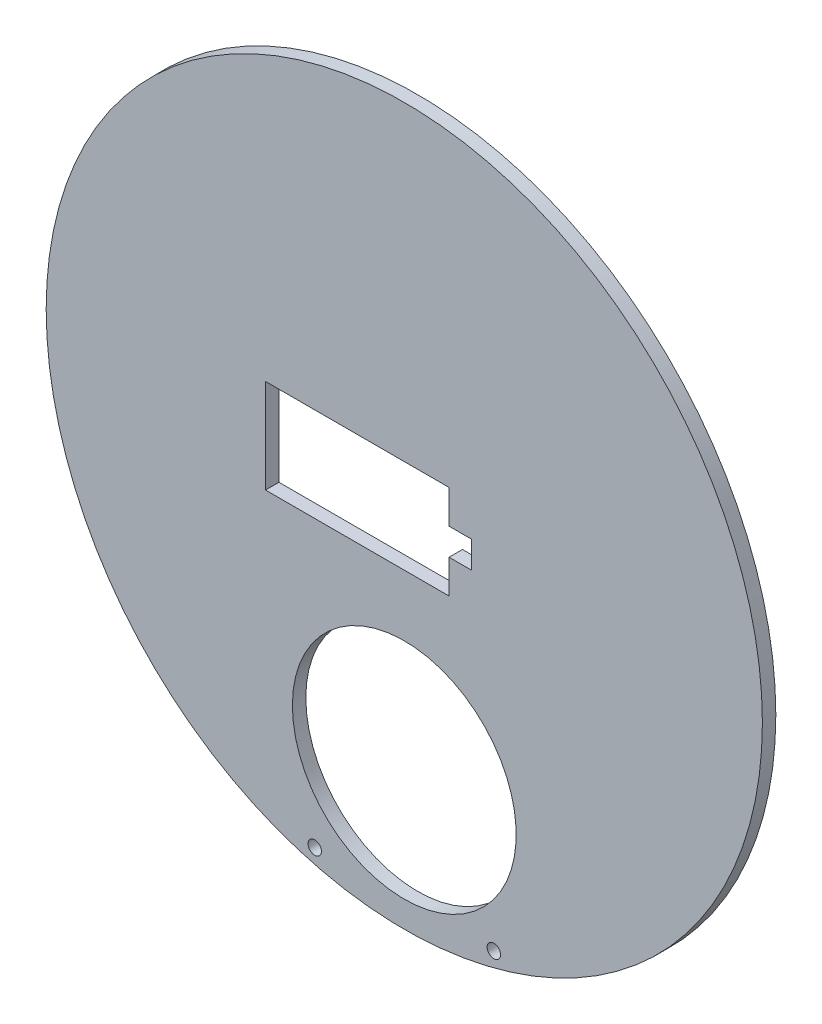
ISO-10303-21;
HEADER;
FILE_DESCRIPTION(('STEP AP214'),'2;1');
FILE_NAME('part.step','',(''),(''),'','','');
FILE_SCHEMA(('AUTOMOTIVE_DESIGN { 1 0 10303 214 1 1 1 1 }'));
ENDSEC;
DATA;
#1=APPLICATION_CONTEXT('core data for automotive mechanical design processes');
#2=APPLICATION_PROTOCOL_DEFINITION('international standard','automotive_design',2000,#1);
#3=PRODUCT_CONTEXT('',#1,'mechanical');
#4=PRODUCT('Part','Part','',(#3));
#5=PRODUCT_RELATED_PRODUCT_CATEGORY('part','',(#4));
#6=PRODUCT_DEFINITION_FORMATION('','',#4);
#7=PRODUCT_DEFINITION_CONTEXT('part definition',#1,'design');
#8=PRODUCT_DEFINITION('design','',#6,#7);
#9=PRODUCT_DEFINITION_SHAPE('','',#8);
#10=(LENGTH_UNIT() NAMED_UNIT(*) SI_UNIT(.MILLI.,.METRE.));
#11=(NAMED_UNIT(*) PLANE_ANGLE_UNIT() SI_UNIT($,.RADIAN.));
#12=(NAMED_UNIT(*) SI_UNIT($,.STERADIAN.) SOLID_ANGLE_UNIT());
#13=UNCERTAINTY_MEASURE_WITH_UNIT(LENGTH_MEASURE(1.E-05),#10,'distance_accuracy_value','');
#14=(GEOMETRIC_REPRESENTATION_CONTEXT(3) GLOBAL_UNCERTAINTY_ASSIGNED_CONTEXT((#13)) GLOBAL_UNIT_ASSIGNED_CONTEXT((#10,
#11,#12)) REPRESENTATION_CONTEXT('',''));
#15=CARTESIAN_POINT('',(0.,0.,0.));
#16=DIRECTION('',(0.,0.,1.));
#17=DIRECTION('',(1.,0.,0.));
#18=AXIS2_PLACEMENT_3D('',#15,#16,#17);
#19=CARTESIAN_POINT('',(-11.1979245368425,8.24446622018527,3.));
#20=DIRECTION('',(0.,0.,-1.));
#21=DIRECTION('',(-1.,0.,0.));
#22=AXIS2_PLACEMENT_3D('',#19,#20,#21);
#23=CYLINDRICAL_SURFACE('',#22,80.);
#24=CARTESIAN_POINT('',(-11.1979245368425,8.24446622018527,3.));
#25=DIRECTION('',(0.,0.,1.));
#26=DIRECTION('',(1.,0.,0.));
#27=AXIS2_PLACEMENT_3D('',#24,#25,#26);
#28=CIRCLE('',#27,80.);
#29=CARTESIAN_POINT('',(68.8020754631575,8.24446622018527,3.));
#30=VERTEX_POINT('',#29);
#31=EDGE_CURVE('E12',#30,#30,#28,.T.);
#32=ORIENTED_EDGE('',*,*,#31,.F.);
#33=EDGE_LOOP('',(#32));
#34=FACE_BOUND('',#33,.T.);
#35=CARTESIAN_POINT('',(-11.1979245368425,8.24446622018527,0.));
#36=DIRECTION('',(0.,0.,1.));
#37=DIRECTION('',(1.,0.,0.));
#38=AXIS2_PLACEMENT_3D('',#35,#36,#37);
#39=CIRCLE('',#38,80.);
#40=CARTESIAN_POINT('',(68.8020754631575,8.24446622018527,0.));
#41=VERTEX_POINT('',#40);
#42=EDGE_CURVE('E48',#41,#41,#39,.T.);
#43=ORIENTED_EDGE('',*,*,#42,.T.);
#44=EDGE_LOOP('',(#43));
#45=FACE_BOUND('',#44,.T.);
#46=ADVANCED_FACE('F45',(#34,#45),#23,.T.);
#47=CARTESIAN_POINT('',(-11.1979245368425,8.24446622018527,3.));
#48=DIRECTION('',(0.,0.,1.));
#49=DIRECTION('',(1.,0.,0.));
#50=AXIS2_PLACEMENT_3D('',#47,#48,#49);
#51=PLANE('',#50);
#52=CARTESIAN_POINT('',(-31.1979245368426,-65.9175186507713,3.));
#53=DIRECTION('',(0.,0.,-1.));
#54=DIRECTION('',(-1.,0.,0.));
#55=AXIS2_PLACEMENT_3D('',#52,#53,#54);
#56=CIRCLE('',#55,1.5);
#57=CARTESIAN_POINT('',(-32.6979245368426,-65.9175186507713,3.));
#58=VERTEX_POINT('',#57);
#59=EDGE_CURVE('E332',#58,#58,#56,.T.);
#60=ORIENTED_EDGE('',*,*,#59,.T.);
#61=EDGE_LOOP('',(#60));
#62=FACE_BOUND('',#61,.T.);
#63=CARTESIAN_POINT('',(8.80207546315744,-65.9198844889249,3.));
#64=DIRECTION('',(0.,0.,-1.));
#65=DIRECTION('',(-1.,0.,0.));
#66=AXIS2_PLACEMENT_3D('',#63,#64,#65);
#67=CIRCLE('',#66,1.5);
#68=CARTESIAN_POINT('',(7.30207546315744,-65.9198844889249,3.));
#69=VERTEX_POINT('',#68);
#70=EDGE_CURVE('E335',#69,#69,#67,.T.);
#71=ORIENTED_EDGE('',*,*,#70,.T.);
#72=EDGE_LOOP('',(#71));
#73=FACE_BOUND('',#72,.T.);
#74=CARTESIAN_POINT('',(-11.1979245368426,-40.9175186507713,3.));
#75=DIRECTION('',(0.,0.,-1.));
#76=DIRECTION('',(-1.,0.,0.));
#77=AXIS2_PLACEMENT_3D('',#74,#75,#76);
#78=CIRCLE('',#77,25.);
#79=CARTESIAN_POINT('',(-36.1979245368426,-40.9175186507713,3.));
#80=VERTEX_POINT('',#79);
#81=EDGE_CURVE('E149',#80,#80,#78,.T.);
#82=ORIENTED_EDGE('',*,*,#81,.T.);
#83=EDGE_LOOP('',(#82));
#84=FACE_BOUND('',#83,.T.);
#85=DIRECTION('',(0.,-1.,0.));
#86=VECTOR('',#85,1.);
#87=CARTESIAN_POINT('',(3.80207546315745,0.,3.));
#88=LINE('',#87,#86);
#89=CARTESIAN_POINT('',(3.80207546315745,11.2444662201853,3.));
#90=VERTEX_POINT('',#89);
#91=CARTESIAN_POINT('',(3.80207546315745,5.24446622018527,3.));
#92=VERTEX_POINT('',#91);
#93=EDGE_CURVE('E111',#90,#92,#88,.T.);
#94=ORIENTED_EDGE('',*,*,#93,.T.);
#95=DIRECTION('',(-1.,0.,0.));
#96=VECTOR('',#95,1.);
#97=CARTESIAN_POINT('',(0.,5.24446622018527,3.));
#98=LINE('',#97,#96);
#99=CARTESIAN_POINT('',(-1.19792453684255,5.24446622018527,3.));
#100=VERTEX_POINT('',#99);
#101=EDGE_CURVE('E120',#92,#100,#98,.T.);
#102=ORIENTED_EDGE('',*,*,#101,.T.);
#103=DIRECTION('',(0.,-1.,0.));
#104=VECTOR('',#103,1.);
#105=CARTESIAN_POINT('',(-1.19792453684255,0.,3.));
#106=LINE('',#105,#104);
#107=CARTESIAN_POINT('',(-1.19792453684255,-2.25553377981473,3.));
#108=VERTEX_POINT('',#107);
#109=EDGE_CURVE('E59',#100,#108,#106,.T.);
#110=ORIENTED_EDGE('',*,*,#109,.T.);
#111=DIRECTION('',(-1.,0.,0.));
#112=VECTOR('',#111,1.);
#113=CARTESIAN_POINT('',(0.,-2.25553377981473,3.));
#114=LINE('',#113,#112);
#115=CARTESIAN_POINT('',(-42.1979245368425,-2.25553377981473,3.));
#116=VERTEX_POINT('',#115);
#117=EDGE_CURVE('E137',#108,#116,#114,.T.);
#118=ORIENTED_EDGE('',*,*,#117,.T.);
#119=DIRECTION('',(0.,-1.,0.));
#120=VECTOR('',#119,1.);
#121=CARTESIAN_POINT('',(-42.1979245368425,0.,3.));
#122=LINE('',#121,#120);
#123=CARTESIAN_POINT('',(-42.1979245368425,18.7444662201853,3.));
#124=VERTEX_POINT('',#123);
#125=EDGE_CURVE('E140',#124,#116,#122,.T.);
#126=ORIENTED_EDGE('',*,*,#125,.F.);
#127=DIRECTION('',(-1.,0.,0.));
#128=VECTOR('',#127,1.);
#129=CARTESIAN_POINT('',(0.,18.7444662201853,3.));
#130=LINE('',#129,#128);
#131=CARTESIAN_POINT('',(-1.19792453684255,18.7444662201853,3.));
#132=VERTEX_POINT('',#131);
#133=EDGE_CURVE('E142',#132,#124,#130,.T.);
#134=ORIENTED_EDGE('',*,*,#133,.F.);
#135=DIRECTION('',(0.,-1.,0.));
#136=VECTOR('',#135,1.);
#137=CARTESIAN_POINT('',(-1.19792453684255,0.,3.));
#138=LINE('',#137,#136);
#139=CARTESIAN_POINT('',(-1.19792453684255,11.2444662201853,3.));
#140=VERTEX_POINT('',#139);
#141=EDGE_CURVE('E144',#132,#140,#138,.T.);
#142=ORIENTED_EDGE('',*,*,#141,.T.);
#143=DIRECTION('',(-1.,0.,0.));
#144=VECTOR('',#143,1.);
#145=CARTESIAN_POINT('',(0.,11.2444662201853,3.));
#146=LINE('',#145,#144);
#147=EDGE_CURVE('E117',#90,#140,#146,.T.);
#148=ORIENTED_EDGE('',*,*,#147,.F.);
#149=EDGE_LOOP('',(#94,#102,#110,#118,#126,#134,#142,#148));
#150=FACE_BOUND('',#149,.T.);
#151=ORIENTED_EDGE('',*,*,#31,.T.);
#152=EDGE_LOOP('',(#151));
#153=FACE_BOUND('',#152,.T.);
#154=ADVANCED_FACE('F124',(#62,#73,#84,#150,#153),#51,.T.);
#155=CARTESIAN_POINT('',(-11.1979245368425,8.24446622018527,0.));
#156=DIRECTION('',(0.,0.,1.));
#157=DIRECTION('',(1.,0.,0.));
#158=AXIS2_PLACEMENT_3D('',#155,#156,#157);
#159=PLANE('',#158);
#160=CARTESIAN_POINT('',(-31.1979245368426,-65.9175186507713,0.));
#161=DIRECTION('',(0.,0.,-1.));
#162=DIRECTION('',(-1.,0.,0.));
#163=AXIS2_PLACEMENT_3D('',#160,#161,#162);
#164=CIRCLE('',#163,1.5);
#165=CARTESIAN_POINT('',(-32.6979245368426,-65.9175186507713,0.));
#166=VERTEX_POINT('',#165);
#167=EDGE_CURVE('E334',#166,#166,#164,.T.);
#168=ORIENTED_EDGE('',*,*,#167,.F.);
#169=EDGE_LOOP('',(#168));
#170=FACE_BOUND('',#169,.T.);
#171=CARTESIAN_POINT('',(8.80207546315744,-65.9198844889249,0.));
#172=DIRECTION('',(0.,0.,-1.));
#173=DIRECTION('',(-1.,0.,0.));
#174=AXIS2_PLACEMENT_3D('',#171,#172,#173);
#175=CIRCLE('',#174,1.5);
#176=CARTESIAN_POINT('',(7.30207546315744,-65.9198844889249,0.));
#177=VERTEX_POINT('',#176);
#178=EDGE_CURVE('E338',#177,#177,#175,.T.);
#179=ORIENTED_EDGE('',*,*,#178,.F.);
#180=EDGE_LOOP('',(#179));
#181=FACE_BOUND('',#180,.T.);
#182=CARTESIAN_POINT('',(-11.1979245368426,-40.9175186507713,0.));
#183=DIRECTION('',(0.,0.,-1.));
#184=DIRECTION('',(-1.,0.,0.));
#185=AXIS2_PLACEMENT_3D('',#182,#183,#184);
#186=CIRCLE('',#185,25.);
#187=CARTESIAN_POINT('',(-36.1979245368426,-40.9175186507713,0.));
#188=VERTEX_POINT('',#187);
#189=EDGE_CURVE('E133',#188,#188,#186,.T.);
#190=ORIENTED_EDGE('',*,*,#189,.F.);
#191=EDGE_LOOP('',(#190));
#192=FACE_BOUND('',#191,.T.);
#193=DIRECTION('',(-1.,0.,0.));
#194=VECTOR('',#193,1.);
#195=CARTESIAN_POINT('',(0.,5.24446622018527,0.));
#196=LINE('',#195,#194);
#197=CARTESIAN_POINT('',(3.80207546315745,5.24446622018527,0.));
#198=VERTEX_POINT('',#197);
#199=CARTESIAN_POINT('',(-1.19792453684255,5.24446622018527,0.));
#200=VERTEX_POINT('',#199);
#201=EDGE_CURVE('E148',#198,#200,#196,.T.);
#202=ORIENTED_EDGE('',*,*,#201,.F.);
#203=DIRECTION('',(0.,-1.,0.));
#204=VECTOR('',#203,1.);
#205=CARTESIAN_POINT('',(3.80207546315745,0.,0.));
#206=LINE('',#205,#204);
#207=CARTESIAN_POINT('',(3.80207546315745,11.2444662201853,0.));
#208=VERTEX_POINT('',#207);
#209=EDGE_CURVE('E67',#208,#198,#206,.T.);
#210=ORIENTED_EDGE('',*,*,#209,.F.);
#211=DIRECTION('',(-1.,0.,0.));
#212=VECTOR('',#211,1.);
#213=CARTESIAN_POINT('',(0.,11.2444662201853,0.));
#214=LINE('',#213,#212);
#215=CARTESIAN_POINT('',(-1.19792453684255,11.2444662201853,0.));
#216=VERTEX_POINT('',#215);
#217=EDGE_CURVE('E127',#208,#216,#214,.T.);
#218=ORIENTED_EDGE('',*,*,#217,.T.);
#219=DIRECTION('',(0.,-1.,0.));
#220=VECTOR('',#219,1.);
#221=CARTESIAN_POINT('',(-1.19792453684255,0.,0.));
#222=LINE('',#221,#220);
#223=CARTESIAN_POINT('',(-1.19792453684255,18.7444662201853,0.));
#224=VERTEX_POINT('',#223);
#225=EDGE_CURVE('E130',#224,#216,#222,.T.);
#226=ORIENTED_EDGE('',*,*,#225,.F.);
#227=DIRECTION('',(-1.,0.,0.));
#228=VECTOR('',#227,1.);
#229=CARTESIAN_POINT('',(0.,18.7444662201853,0.));
#230=LINE('',#229,#228);
#231=CARTESIAN_POINT('',(-42.1979245368425,18.7444662201853,0.));
#232=VERTEX_POINT('',#231);
#233=EDGE_CURVE('E160',#224,#232,#230,.T.);
#234=ORIENTED_EDGE('',*,*,#233,.T.);
#235=DIRECTION('',(0.,-1.,0.));
#236=VECTOR('',#235,1.);
#237=CARTESIAN_POINT('',(-42.1979245368425,0.,0.));
#238=LINE('',#237,#236);
#239=CARTESIAN_POINT('',(-42.1979245368425,-2.25553377981473,0.));
#240=VERTEX_POINT('',#239);
#241=EDGE_CURVE('E157',#232,#240,#238,.T.);
#242=ORIENTED_EDGE('',*,*,#241,.T.);
#243=DIRECTION('',(-1.,0.,0.));
#244=VECTOR('',#243,1.);
#245=CARTESIAN_POINT('',(0.,-2.25553377981473,0.));
#246=LINE('',#245,#244);
#247=CARTESIAN_POINT('',(-1.19792453684255,-2.25553377981473,0.));
#248=VERTEX_POINT('',#247);
#249=EDGE_CURVE('E154',#248,#240,#246,.T.);
#250=ORIENTED_EDGE('',*,*,#249,.F.);
#251=DIRECTION('',(0.,-1.,0.));
#252=VECTOR('',#251,1.);
#253=CARTESIAN_POINT('',(-1.19792453684255,0.,0.));
#254=LINE('',#253,#252);
#255=EDGE_CURVE('E151',#200,#248,#254,.T.);
#256=ORIENTED_EDGE('',*,*,#255,.F.);
#257=EDGE_LOOP('',(#202,#210,#218,#226,#234,#242,#250,#256));
#258=FACE_BOUND('',#257,.T.);
#259=ORIENTED_EDGE('',*,*,#42,.F.);
#260=EDGE_LOOP('',(#259));
#261=FACE_BOUND('',#260,.T.);
#262=ADVANCED_FACE('F181',(#170,#181,#192,#258,#261),#159,.F.);
#263=CARTESIAN_POINT('',(3.80207546315745,0.,3.));
#264=DIRECTION('',(1.,0.,0.));
#265=DIRECTION('',(0.,1.,0.));
#266=AXIS2_PLACEMENT_3D('',#263,#264,#265);
#267=PLANE('',#266);
#268=ORIENTED_EDGE('',*,*,#209,.T.);
#269=DIRECTION('',(0.,0.,-1.));
#270=VECTOR('',#269,1.);
#271=CARTESIAN_POINT('',(3.80207546315745,5.24446622018527,3.));
#272=LINE('',#271,#270);
#273=EDGE_CURVE('E107',#92,#198,#272,.T.);
#274=ORIENTED_EDGE('',*,*,#273,.F.);
#275=ORIENTED_EDGE('',*,*,#93,.F.);
#276=DIRECTION('',(0.,0.,-1.));
#277=VECTOR('',#276,1.);
#278=CARTESIAN_POINT('',(3.80207546315745,11.2444662201853,3.));
#279=LINE('',#278,#277);
#280=EDGE_CURVE('E165',#90,#208,#279,.T.);
#281=ORIENTED_EDGE('',*,*,#280,.T.);
#282=EDGE_LOOP('',(#268,#274,#275,#281));
#283=FACE_BOUND('',#282,.T.);
#284=ADVANCED_FACE('F109',(#283),#267,.F.);
#285=CARTESIAN_POINT('',(0.,11.2444662201853,3.));
#286=DIRECTION('',(0.,-1.,0.));
#287=DIRECTION('',(0.,0.,-1.));
#288=AXIS2_PLACEMENT_3D('',#285,#286,#287);
#289=PLANE('',#288);
#290=ORIENTED_EDGE('',*,*,#217,.F.);
#291=ORIENTED_EDGE('',*,*,#280,.F.);
#292=ORIENTED_EDGE('',*,*,#147,.T.);
#293=DIRECTION('',(0.,0.,-1.));
#294=VECTOR('',#293,1.);
#295=CARTESIAN_POINT('',(-1.19792453684255,11.2444662201853,3.));
#296=LINE('',#295,#294);
#297=EDGE_CURVE('E167',#140,#216,#296,.T.);
#298=ORIENTED_EDGE('',*,*,#297,.T.);
#299=EDGE_LOOP('',(#290,#291,#292,#298));
#300=FACE_BOUND('',#299,.T.);
#301=ADVANCED_FACE('F203',(#300),#289,.T.);
#302=CARTESIAN_POINT('',(-1.19792453684255,0.,3.));
#303=DIRECTION('',(1.,0.,0.));
#304=DIRECTION('',(0.,1.,0.));
#305=AXIS2_PLACEMENT_3D('',#302,#303,#304);
#306=PLANE('',#305);
#307=ORIENTED_EDGE('',*,*,#225,.T.);
#308=ORIENTED_EDGE('',*,*,#297,.F.);
#309=ORIENTED_EDGE('',*,*,#141,.F.);
#310=DIRECTION('',(0.,0.,-1.));
#311=VECTOR('',#310,1.);
#312=CARTESIAN_POINT('',(-1.19792453684255,18.7444662201853,3.));
#313=LINE('',#312,#311);
#314=EDGE_CURVE('E169',#132,#224,#313,.T.);
#315=ORIENTED_EDGE('',*,*,#314,.T.);
#316=EDGE_LOOP('',(#307,#308,#309,#315));
#317=FACE_BOUND('',#316,.T.);
#318=ADVANCED_FACE('F200',(#317),#306,.F.);
#319=CARTESIAN_POINT('',(0.,18.7444662201853,3.));
#320=DIRECTION('',(0.,-1.,0.));
#321=DIRECTION('',(0.,0.,-1.));
#322=AXIS2_PLACEMENT_3D('',#319,#320,#321);
#323=PLANE('',#322);
#324=ORIENTED_EDGE('',*,*,#233,.F.);
#325=ORIENTED_EDGE('',*,*,#314,.F.);
#326=ORIENTED_EDGE('',*,*,#133,.T.);
#327=DIRECTION('',(0.,0.,-1.));
#328=VECTOR('',#327,1.);
#329=CARTESIAN_POINT('',(-42.1979245368425,18.7444662201853,3.));
#330=LINE('',#329,#328);
#331=EDGE_CURVE('E171',#124,#232,#330,.T.);
#332=ORIENTED_EDGE('',*,*,#331,.T.);
#333=EDGE_LOOP('',(#324,#325,#326,#332));
#334=FACE_BOUND('',#333,.T.);
#335=ADVANCED_FACE('F195',(#334),#323,.T.);
#336=CARTESIAN_POINT('',(-42.1979245368425,0.,3.));
#337=DIRECTION('',(1.,0.,0.));
#338=DIRECTION('',(0.,0.,-1.));
#339=AXIS2_PLACEMENT_3D('',#336,#337,#338);
#340=PLANE('',#339);
#341=ORIENTED_EDGE('',*,*,#241,.F.);
#342=ORIENTED_EDGE('',*,*,#331,.F.);
#343=ORIENTED_EDGE('',*,*,#125,.T.);
#344=DIRECTION('',(0.,0.,-1.));
#345=VECTOR('',#344,1.);
#346=CARTESIAN_POINT('',(-42.1979245368425,-2.25553377981473,3.));
#347=LINE('',#346,#345);
#348=EDGE_CURVE('E173',#116,#240,#347,.T.);
#349=ORIENTED_EDGE('',*,*,#348,.T.);
#350=EDGE_LOOP('',(#341,#342,#343,#349));
#351=FACE_BOUND('',#350,.T.);
#352=ADVANCED_FACE('F192',(#351),#340,.T.);
#353=CARTESIAN_POINT('',(0.,-2.25553377981473,3.));
#354=DIRECTION('',(0.,-1.,0.));
#355=DIRECTION('',(0.,0.,-1.));
#356=AXIS2_PLACEMENT_3D('',#353,#354,#355);
#357=PLANE('',#356);
#358=ORIENTED_EDGE('',*,*,#249,.T.);
#359=ORIENTED_EDGE('',*,*,#348,.F.);
#360=ORIENTED_EDGE('',*,*,#117,.F.);
#361=DIRECTION('',(0.,0.,-1.));
#362=VECTOR('',#361,1.);
#363=CARTESIAN_POINT('',(-1.19792453684255,-2.25553377981473,3.));
#364=LINE('',#363,#362);
#365=EDGE_CURVE('E175',#108,#248,#364,.T.);
#366=ORIENTED_EDGE('',*,*,#365,.T.);
#367=EDGE_LOOP('',(#358,#359,#360,#366));
#368=FACE_BOUND('',#367,.T.);
#369=ADVANCED_FACE('F186',(#368),#357,.F.);
#370=CARTESIAN_POINT('',(-1.19792453684255,0.,3.));
#371=DIRECTION('',(1.,0.,0.));
#372=DIRECTION('',(0.,1.,0.));
#373=AXIS2_PLACEMENT_3D('',#370,#371,#372);
#374=PLANE('',#373);
#375=ORIENTED_EDGE('',*,*,#255,.T.);
#376=ORIENTED_EDGE('',*,*,#365,.F.);
#377=ORIENTED_EDGE('',*,*,#109,.F.);
#378=DIRECTION('',(0.,0.,-1.));
#379=VECTOR('',#378,1.);
#380=CARTESIAN_POINT('',(-1.19792453684255,5.24446622018527,3.));
#381=LINE('',#380,#379);
#382=EDGE_CURVE('E116',#100,#200,#381,.T.);
#383=ORIENTED_EDGE('',*,*,#382,.T.);
#384=EDGE_LOOP('',(#375,#376,#377,#383));
#385=FACE_BOUND('',#384,.T.);
#386=ADVANCED_FACE('F177',(#385),#374,.F.);
#387=CARTESIAN_POINT('',(0.,5.24446622018527,3.));
#388=DIRECTION('',(0.,-1.,0.));
#389=DIRECTION('',(0.,0.,-1.));
#390=AXIS2_PLACEMENT_3D('',#387,#388,#389);
#391=PLANE('',#390);
#392=ORIENTED_EDGE('',*,*,#201,.T.);
#393=ORIENTED_EDGE('',*,*,#382,.F.);
#394=ORIENTED_EDGE('',*,*,#101,.F.);
#395=ORIENTED_EDGE('',*,*,#273,.T.);
#396=EDGE_LOOP('',(#392,#393,#394,#395));
#397=FACE_BOUND('',#396,.T.);
#398=ADVANCED_FACE('F121',(#397),#391,.F.);
#399=CARTESIAN_POINT('',(-11.1979245368426,-40.9175186507713,3.));
#400=DIRECTION('',(0.,0.,-1.));
#401=DIRECTION('',(-1.,0.,0.));
#402=AXIS2_PLACEMENT_3D('',#399,#400,#401);
#403=CYLINDRICAL_SURFACE('',#402,25.);
#404=ORIENTED_EDGE('',*,*,#81,.F.);
#405=EDGE_LOOP('',(#404));
#406=FACE_BOUND('',#405,.T.);
#407=ORIENTED_EDGE('',*,*,#189,.T.);
#408=EDGE_LOOP('',(#407));
#409=FACE_BOUND('',#408,.T.);
#410=ADVANCED_FACE('F233',(#406,#409),#403,.F.);
#411=CARTESIAN_POINT('',(8.80207546315744,-65.9198844889249,3.));
#412=DIRECTION('',(0.,0.,-1.));
#413=DIRECTION('',(-1.,0.,0.));
#414=AXIS2_PLACEMENT_3D('',#411,#412,#413);
#415=CYLINDRICAL_SURFACE('',#414,1.5);
#416=ORIENTED_EDGE('',*,*,#70,.F.);
#417=EDGE_LOOP('',(#416));
#418=FACE_BOUND('',#417,.T.);
#419=ORIENTED_EDGE('',*,*,#178,.T.);
#420=EDGE_LOOP('',(#419));
#421=FACE_BOUND('',#420,.T.);
#422=ADVANCED_FACE('F268',(#418,#421),#415,.F.);
#423=CARTESIAN_POINT('',(-31.1979245368426,-65.9175186507713,3.));
#424=DIRECTION('',(0.,0.,-1.));
#425=DIRECTION('',(-1.,0.,0.));
#426=AXIS2_PLACEMENT_3D('',#423,#424,#425);
#427=CYLINDRICAL_SURFACE('',#426,1.5);
#428=ORIENTED_EDGE('',*,*,#59,.F.);
#429=EDGE_LOOP('',(#428));
#430=FACE_BOUND('',#429,.T.);
#431=ORIENTED_EDGE('',*,*,#167,.T.);
#432=EDGE_LOOP('',(#431));
#433=FACE_BOUND('',#432,.T.);
#434=ADVANCED_FACE('F275',(#430,#433),#427,.F.);
#435=CLOSED_SHELL('',(#46,#154,#262,#284,#301,#318,#335,#352,#369,#386,#398,#410,#422,#434));
#436=MANIFOLD_SOLID_BREP('B2',#435);
#437=ADVANCED_BREP_SHAPE_REPRESENTATION('',(#18,#436),#14);
#438=SHAPE_DEFINITION_REPRESENTATION(#9,#437);
ENDSEC;
END-ISO-10303-21;
